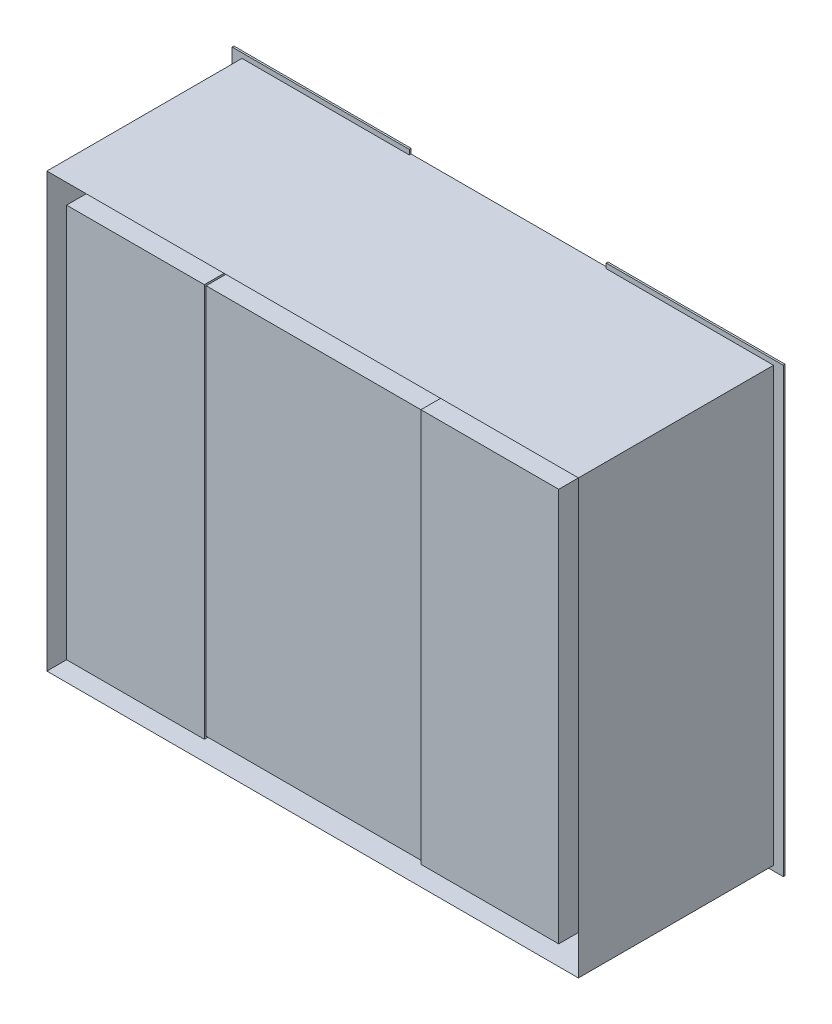
ISO-10303-21;
HEADER;
FILE_DESCRIPTION(('STEP AP214'),'2;1');
FILE_NAME('part.step','',(''),(''),'','','');
FILE_SCHEMA(('AUTOMOTIVE_DESIGN { 1 0 10303 214 1 1 1 1 }'));
ENDSEC;
DATA;
#1=APPLICATION_CONTEXT('core data for automotive mechanical design processes');
#2=APPLICATION_PROTOCOL_DEFINITION('international standard','automotive_design',2000,#1);
#3=PRODUCT_CONTEXT('',#1,'mechanical');
#4=PRODUCT('Part','Part','',(#3));
#5=PRODUCT_RELATED_PRODUCT_CATEGORY('part','',(#4));
#6=PRODUCT_DEFINITION_FORMATION('','',#4);
#7=PRODUCT_DEFINITION_CONTEXT('part definition',#1,'design');
#8=PRODUCT_DEFINITION('design','',#6,#7);
#9=PRODUCT_DEFINITION_SHAPE('','',#8);
#10=(LENGTH_UNIT() NAMED_UNIT(*) SI_UNIT(.MILLI.,.METRE.));
#11=(NAMED_UNIT(*) PLANE_ANGLE_UNIT() SI_UNIT($,.RADIAN.));
#12=(NAMED_UNIT(*) SI_UNIT($,.STERADIAN.) SOLID_ANGLE_UNIT());
#13=UNCERTAINTY_MEASURE_WITH_UNIT(LENGTH_MEASURE(1.E-05),#10,'distance_accuracy_value','');
#14=(GEOMETRIC_REPRESENTATION_CONTEXT(3) GLOBAL_UNCERTAINTY_ASSIGNED_CONTEXT((#13)) GLOBAL_UNIT_ASSIGNED_CONTEXT((#10,
#11,#12)) REPRESENTATION_CONTEXT('',''));
#15=CARTESIAN_POINT('',(0.,0.,0.));
#16=DIRECTION('',(0.,0.,1.));
#17=DIRECTION('',(1.,0.,0.));
#18=AXIS2_PLACEMENT_3D('',#15,#16,#17);
#19=CARTESIAN_POINT('',(-0.5,1.125,0.0762));
#20=DIRECTION('',(0.,1.,0.));
#21=DIRECTION('',(1.,0.,0.));
#22=AXIS2_PLACEMENT_3D('',#19,#20,#21);
#23=PLANE('',#22);
#24=DIRECTION('',(0.,0.,1.));
#25=VECTOR('',#24,1.);
#26=CARTESIAN_POINT('',(-1.4,1.125,0.0762));
#27=LINE('',#26,#25);
#28=CARTESIAN_POINT('',(-1.4,1.125,0.0762));
#29=VERTEX_POINT('',#28);
#30=CARTESIAN_POINT('',(-1.4,1.125,0.0852));
#31=VERTEX_POINT('',#30);
#32=EDGE_CURVE('P0_E11',#29,#31,#27,.T.);
#33=ORIENTED_EDGE('',*,*,#32,.T.);
#34=DIRECTION('',(-1.,0.,0.));
#35=VECTOR('',#34,1.);
#36=CARTESIAN_POINT('',(-0.5,1.125,0.0852));
#37=LINE('',#36,#35);
#38=CARTESIAN_POINT('',(-0.5,1.125,0.0852));
#39=VERTEX_POINT('',#38);
#40=EDGE_CURVE('P0_E263',#39,#31,#37,.T.);
#41=ORIENTED_EDGE('',*,*,#40,.F.);
#42=DIRECTION('',(0.,0.,1.));
#43=VECTOR('',#42,1.);
#44=CARTESIAN_POINT('',(-0.5,1.125,0.0762));
#45=LINE('',#44,#43);
#46=CARTESIAN_POINT('',(-0.5,1.125,0.0762));
#47=VERTEX_POINT('',#46);
#48=EDGE_CURVE('P0_E329',#47,#39,#45,.T.);
#49=ORIENTED_EDGE('',*,*,#48,.F.);
#50=DIRECTION('',(-1.,0.,0.));
#51=VECTOR('',#50,1.);
#52=CARTESIAN_POINT('',(-0.5,1.125,0.0762));
#53=LINE('',#52,#51);
#54=EDGE_CURVE('P0_E212',#47,#29,#53,.T.);
#55=ORIENTED_EDGE('',*,*,#54,.T.);
#56=EDGE_LOOP('',(#33,#41,#49,#55));
#57=FACE_BOUND('',#56,.T.);
#58=ADVANCED_FACE('P0_F17',(#57),#23,.T.);
#59=CARTESIAN_POINT('',(-1.4,1.125,0.0762));
#60=DIRECTION('',(-1.,0.,0.));
#61=DIRECTION('',(0.,0.,1.));
#62=AXIS2_PLACEMENT_3D('',#59,#60,#61);
#63=PLANE('',#62);
#64=DIRECTION('',(0.,0.,1.));
#65=VECTOR('',#64,1.);
#66=CARTESIAN_POINT('',(-1.4,-1.125,0.0762));
#67=LINE('',#66,#65);
#68=CARTESIAN_POINT('',(-1.4,-1.125,0.0762));
#69=VERTEX_POINT('',#68);
#70=CARTESIAN_POINT('',(-1.4,-1.125,0.0852));
#71=VERTEX_POINT('',#70);
#72=EDGE_CURVE('P0_E28',#69,#71,#67,.T.);
#73=ORIENTED_EDGE('',*,*,#72,.T.);
#74=DIRECTION('',(0.,-1.,0.));
#75=VECTOR('',#74,1.);
#76=CARTESIAN_POINT('',(-1.4,1.125,0.0852));
#77=LINE('',#76,#75);
#78=EDGE_CURVE('P0_E211',#31,#71,#77,.T.);
#79=ORIENTED_EDGE('',*,*,#78,.F.);
#80=ORIENTED_EDGE('',*,*,#32,.F.);
#81=DIRECTION('',(0.,-1.,0.));
#82=VECTOR('',#81,1.);
#83=CARTESIAN_POINT('',(-1.4,1.125,0.0762));
#84=LINE('',#83,#82);
#85=EDGE_CURVE('P0_E273',#29,#69,#84,.T.);
#86=ORIENTED_EDGE('',*,*,#85,.T.);
#87=EDGE_LOOP('',(#73,#79,#80,#86));
#88=FACE_BOUND('',#87,.T.);
#89=ADVANCED_FACE('P0_F541',(#88),#63,.T.);
#90=CARTESIAN_POINT('',(-1.4,-1.125,0.0762));
#91=DIRECTION('',(0.,-1.,0.));
#92=DIRECTION('',(0.,0.,-1.));
#93=AXIS2_PLACEMENT_3D('',#90,#91,#92);
#94=PLANE('',#93);
#95=DIRECTION('',(0.,0.,1.));
#96=VECTOR('',#95,1.);
#97=CARTESIAN_POINT('',(-0.5,-1.125,0.0762));
#98=LINE('',#97,#96);
#99=CARTESIAN_POINT('',(-0.5,-1.125,0.0762));
#100=VERTEX_POINT('',#99);
#101=CARTESIAN_POINT('',(-0.5,-1.125,0.0852));
#102=VERTEX_POINT('',#101);
#103=EDGE_CURVE('P0_E326',#100,#102,#98,.T.);
#104=ORIENTED_EDGE('',*,*,#103,.T.);
#105=DIRECTION('',(1.,0.,0.));
#106=VECTOR('',#105,1.);
#107=CARTESIAN_POINT('',(-1.4,-1.125,0.0852));
#108=LINE('',#107,#106);
#109=EDGE_CURVE('P0_E207',#71,#102,#108,.T.);
#110=ORIENTED_EDGE('',*,*,#109,.F.);
#111=ORIENTED_EDGE('',*,*,#72,.F.);
#112=DIRECTION('',(1.,0.,0.));
#113=VECTOR('',#112,1.);
#114=CARTESIAN_POINT('',(-1.4,-1.125,0.0762));
#115=LINE('',#114,#113);
#116=EDGE_CURVE('P0_E269',#69,#100,#115,.T.);
#117=ORIENTED_EDGE('',*,*,#116,.T.);
#118=EDGE_LOOP('',(#104,#110,#111,#117));
#119=FACE_BOUND('',#118,.T.);
#120=ADVANCED_FACE('P0_F549',(#119),#94,.T.);
#121=CARTESIAN_POINT('',(1.4,1.125,0.0762));
#122=DIRECTION('',(0.,1.,0.));
#123=DIRECTION('',(1.,0.,0.));
#124=AXIS2_PLACEMENT_3D('',#121,#122,#123);
#125=PLANE('',#124);
#126=DIRECTION('',(0.,0.,1.));
#127=VECTOR('',#126,1.);
#128=CARTESIAN_POINT('',(0.5,1.125,0.0762));
#129=LINE('',#128,#127);
#130=CARTESIAN_POINT('',(0.5,1.125,0.0762));
#131=VERTEX_POINT('',#130);
#132=CARTESIAN_POINT('',(0.5,1.125,0.0852));
#133=VERTEX_POINT('',#132);
#134=EDGE_CURVE('P0_E227',#131,#133,#129,.T.);
#135=ORIENTED_EDGE('',*,*,#134,.T.);
#136=DIRECTION('',(-1.,0.,0.));
#137=VECTOR('',#136,1.);
#138=CARTESIAN_POINT('',(1.4,1.125,0.0852));
#139=LINE('',#138,#137);
#140=CARTESIAN_POINT('',(1.4,1.125,0.0852));
#141=VERTEX_POINT('',#140);
#142=EDGE_CURVE('P0_E199',#141,#133,#139,.T.);
#143=ORIENTED_EDGE('',*,*,#142,.F.);
#144=DIRECTION('',(0.,0.,1.));
#145=VECTOR('',#144,1.);
#146=CARTESIAN_POINT('',(1.4,1.125,0.0762));
#147=LINE('',#146,#145);
#148=CARTESIAN_POINT('',(1.4,1.125,0.0762));
#149=VERTEX_POINT('',#148);
#150=EDGE_CURVE('P0_E284',#149,#141,#147,.T.);
#151=ORIENTED_EDGE('',*,*,#150,.F.);
#152=DIRECTION('',(-1.,0.,0.));
#153=VECTOR('',#152,1.);
#154=CARTESIAN_POINT('',(1.4,1.125,0.0762));
#155=LINE('',#154,#153);
#156=EDGE_CURVE('P0_E297',#149,#131,#155,.T.);
#157=ORIENTED_EDGE('',*,*,#156,.T.);
#158=EDGE_LOOP('',(#135,#143,#151,#157));
#159=FACE_BOUND('',#158,.T.);
#160=ADVANCED_FACE('P0_F554',(#159),#125,.T.);
#161=CARTESIAN_POINT('',(-0.55,1.,1.0672));
#162=DIRECTION('',(0.,0.,-1.));
#163=DIRECTION('',(0.,-1.,0.));
#164=AXIS2_PLACEMENT_3D('',#161,#162,#163);
#165=PLANE('',#164);
#166=DIRECTION('',(0.,-1.,0.));
#167=VECTOR('',#166,1.);
#168=CARTESIAN_POINT('',(-0.55,0.991,1.0672));
#169=LINE('',#168,#167);
#170=CARTESIAN_POINT('',(-0.55,0.991,1.0672));
#171=VERTEX_POINT('',#170);
#172=CARTESIAN_POINT('',(-0.55,-0.991,1.0672));
#173=VERTEX_POINT('',#172);
#174=EDGE_CURVE('P0_E283',#171,#173,#169,.T.);
#175=ORIENTED_EDGE('',*,*,#174,.T.);
#176=DIRECTION('',(1.,0.,0.));
#177=VECTOR('',#176,1.);
#178=CARTESIAN_POINT('',(-0.55,-0.991,1.0672));
#179=LINE('',#178,#177);
#180=CARTESIAN_POINT('',(0.55,-0.991,1.0672));
#181=VERTEX_POINT('',#180);
#182=EDGE_CURVE('P0_E42',#173,#181,#179,.T.);
#183=ORIENTED_EDGE('',*,*,#182,.T.);
#184=DIRECTION('',(0.,-1.,0.));
#185=VECTOR('',#184,1.);
#186=CARTESIAN_POINT('',(0.55,0.991,1.0672));
#187=LINE('',#186,#185);
#188=CARTESIAN_POINT('',(0.55,0.991,1.0672));
#189=VERTEX_POINT('',#188);
#190=EDGE_CURVE('P0_E378',#189,#181,#187,.T.);
#191=ORIENTED_EDGE('',*,*,#190,.F.);
#192=DIRECTION('',(1.,0.,0.));
#193=VECTOR('',#192,1.);
#194=CARTESIAN_POINT('',(-0.55,0.991,1.0672));
#195=LINE('',#194,#193);
#196=EDGE_CURVE('P0_E282',#171,#189,#195,.T.);
#197=ORIENTED_EDGE('',*,*,#196,.F.);
#198=EDGE_LOOP('',(#175,#183,#191,#197));
#199=FACE_BOUND('',#198,.T.);
#200=ADVANCED_FACE('P0_F498',(#199),#165,.F.);
#201=CARTESIAN_POINT('',(-0.55,-0.991,1.0762));
#202=DIRECTION('',(0.,1.,0.));
#203=DIRECTION('',(1.,0.,0.));
#204=AXIS2_PLACEMENT_3D('',#201,#202,#203);
#205=PLANE('',#204);
#206=DIRECTION('',(1.,0.,0.));
#207=VECTOR('',#206,1.);
#208=CARTESIAN_POINT('',(-0.5,-0.991,0.0852));
#209=LINE('',#208,#207);
#210=CARTESIAN_POINT('',(-0.5,-0.991,0.0852));
#211=VERTEX_POINT('',#210);
#212=CARTESIAN_POINT('',(0.5,-0.991,0.0852));
#213=VERTEX_POINT('',#212);
#214=EDGE_CURVE('P0_E234',#211,#213,#209,.T.);
#215=ORIENTED_EDGE('',*,*,#214,.T.);
#216=DIRECTION('',(1.,0.,0.));
#217=VECTOR('',#216,1.);
#218=CARTESIAN_POINT('',(0.5,-0.991,0.0852));
#219=LINE('',#218,#217);
#220=CARTESIAN_POINT('',(0.55,-0.991,0.0852));
#221=VERTEX_POINT('',#220);
#222=EDGE_CURVE('P0_E242',#213,#221,#219,.T.);
#223=ORIENTED_EDGE('',*,*,#222,.T.);
#224=DIRECTION('',(0.,0.,-1.));
#225=VECTOR('',#224,1.);
#226=CARTESIAN_POINT('',(0.55,-0.991,1.0672));
#227=LINE('',#226,#225);
#228=EDGE_CURVE('P0_E206',#181,#221,#227,.T.);
#229=ORIENTED_EDGE('',*,*,#228,.F.);
#230=ORIENTED_EDGE('',*,*,#182,.F.);
#231=DIRECTION('',(0.,0.,-1.));
#232=VECTOR('',#231,1.);
#233=CARTESIAN_POINT('',(-0.55,-0.991,1.0672));
#234=LINE('',#233,#232);
#235=CARTESIAN_POINT('',(-0.55,-0.991,0.0852));
#236=VERTEX_POINT('',#235);
#237=EDGE_CURVE('P0_E374',#173,#236,#234,.T.);
#238=ORIENTED_EDGE('',*,*,#237,.T.);
#239=DIRECTION('',(1.,0.,0.));
#240=VECTOR('',#239,1.);
#241=CARTESIAN_POINT('',(-0.55,-0.991,0.0852));
#242=LINE('',#241,#240);
#243=EDGE_CURVE('P0_E210',#236,#211,#242,.T.);
#244=ORIENTED_EDGE('',*,*,#243,.T.);
#245=EDGE_LOOP('',(#215,#223,#229,#230,#238,#244));
#246=FACE_BOUND('',#245,.T.);
#247=ADVANCED_FACE('P0_F497',(#246),#205,.F.);
#248=CARTESIAN_POINT('',(0.55,-1.,0.0852));
#249=DIRECTION('',(1.,0.,0.));
#250=DIRECTION('',(0.,1.,0.));
#251=AXIS2_PLACEMENT_3D('',#248,#249,#250);
#252=PLANE('',#251);
#253=DIRECTION('',(0.,0.,1.));
#254=VECTOR('',#253,1.);
#255=CARTESIAN_POINT('',(0.55,-1.,0.0852));
#256=LINE('',#255,#254);
#257=CARTESIAN_POINT('',(0.55,-1.,0.0852));
#258=VERTEX_POINT('',#257);
#259=CARTESIAN_POINT('',(0.55,-1.,1.0762));
#260=VERTEX_POINT('',#259);
#261=EDGE_CURVE('P0_E251',#258,#260,#256,.T.);
#262=ORIENTED_EDGE('',*,*,#261,.T.);
#263=DIRECTION('',(0.,1.,0.));
#264=VECTOR('',#263,1.);
#265=CARTESIAN_POINT('',(0.55,-1.,1.0762));
#266=LINE('',#265,#264);
#267=CARTESIAN_POINT('',(0.55,1.,1.0762));
#268=VERTEX_POINT('',#267);
#269=EDGE_CURVE('P0_E169',#260,#268,#266,.T.);
#270=ORIENTED_EDGE('',*,*,#269,.T.);
#271=DIRECTION('',(0.,0.,1.));
#272=VECTOR('',#271,1.);
#273=CARTESIAN_POINT('',(0.55,1.,0.0852));
#274=LINE('',#273,#272);
#275=CARTESIAN_POINT('',(0.55,1.,0.0852));
#276=VERTEX_POINT('',#275);
#277=EDGE_CURVE('P0_E160',#276,#268,#274,.T.);
#278=ORIENTED_EDGE('',*,*,#277,.F.);
#279=DIRECTION('',(0.,1.,0.));
#280=VECTOR('',#279,1.);
#281=CARTESIAN_POINT('',(0.55,0.991,0.0852));
#282=LINE('',#281,#280);
#283=CARTESIAN_POINT('',(0.55,0.991,0.0852));
#284=VERTEX_POINT('',#283);
#285=EDGE_CURVE('P0_E166',#284,#276,#282,.T.);
#286=ORIENTED_EDGE('',*,*,#285,.F.);
#287=DIRECTION('',(0.,0.,1.));
#288=VECTOR('',#287,1.);
#289=CARTESIAN_POINT('',(0.55,0.991,0.0852));
#290=LINE('',#289,#288);
#291=EDGE_CURVE('P0_E21',#284,#189,#290,.T.);
#292=ORIENTED_EDGE('',*,*,#291,.T.);
#293=ORIENTED_EDGE('',*,*,#190,.T.);
#294=ORIENTED_EDGE('',*,*,#228,.T.);
#295=DIRECTION('',(0.,1.,0.));
#296=VECTOR('',#295,1.);
#297=CARTESIAN_POINT('',(0.55,-1.,0.0852));
#298=LINE('',#297,#296);
#299=EDGE_CURVE('P0_E332',#258,#221,#298,.T.);
#300=ORIENTED_EDGE('',*,*,#299,.F.);
#301=EDGE_LOOP('',(#262,#270,#278,#286,#292,#293,#294,#300));
#302=FACE_BOUND('',#301,.T.);
#303=ADVANCED_FACE('P0_F163',(#302),#252,.F.);
#304=CARTESIAN_POINT('',(-0.55,0.991,0.0762));
#305=DIRECTION('',(0.,-1.,0.));
#306=DIRECTION('',(0.,0.,-1.));
#307=AXIS2_PLACEMENT_3D('',#304,#305,#306);
#308=PLANE('',#307);
#309=DIRECTION('',(0.,0.,1.));
#310=VECTOR('',#309,1.);
#311=CARTESIAN_POINT('',(-0.55,0.991,0.0852));
#312=LINE('',#311,#310);
#313=CARTESIAN_POINT('',(-0.55,0.991,0.0852));
#314=VERTEX_POINT('',#313);
#315=EDGE_CURVE('P0_E152',#314,#171,#312,.T.);
#316=ORIENTED_EDGE('',*,*,#315,.T.);
#317=ORIENTED_EDGE('',*,*,#196,.T.);
#318=ORIENTED_EDGE('',*,*,#291,.F.);
#319=DIRECTION('',(1.,0.,0.));
#320=VECTOR('',#319,1.);
#321=CARTESIAN_POINT('',(0.5,0.991,0.0852));
#322=LINE('',#321,#320);
#323=CARTESIAN_POINT('',(0.5,0.991,0.0852));
#324=VERTEX_POINT('',#323);
#325=EDGE_CURVE('P0_E190',#324,#284,#322,.T.);
#326=ORIENTED_EDGE('',*,*,#325,.F.);
#327=DIRECTION('',(1.,0.,0.));
#328=VECTOR('',#327,1.);
#329=CARTESIAN_POINT('',(-0.5,0.991,0.0852));
#330=LINE('',#329,#328);
#331=CARTESIAN_POINT('',(-0.5,0.991,0.0852));
#332=VERTEX_POINT('',#331);
#333=EDGE_CURVE('P0_E239',#332,#324,#330,.T.);
#334=ORIENTED_EDGE('',*,*,#333,.F.);
#335=DIRECTION('',(1.,0.,0.));
#336=VECTOR('',#335,1.);
#337=CARTESIAN_POINT('',(-0.55,0.991,0.0852));
#338=LINE('',#337,#336);
#339=EDGE_CURVE('P0_E250',#314,#332,#338,.T.);
#340=ORIENTED_EDGE('',*,*,#339,.F.);
#341=EDGE_LOOP('',(#316,#317,#318,#326,#334,#340));
#342=FACE_BOUND('',#341,.T.);
#343=ADVANCED_FACE('P0_F503',(#342),#308,.F.);
#344=CARTESIAN_POINT('',(-0.55,-1.,0.0762));
#345=DIRECTION('',(-1.,0.,0.));
#346=DIRECTION('',(0.,0.,1.));
#347=AXIS2_PLACEMENT_3D('',#344,#345,#346);
#348=PLANE('',#347);
#349=ORIENTED_EDGE('',*,*,#237,.F.);
#350=ORIENTED_EDGE('',*,*,#174,.F.);
#351=ORIENTED_EDGE('',*,*,#315,.F.);
#352=DIRECTION('',(0.,1.,0.));
#353=VECTOR('',#352,1.);
#354=CARTESIAN_POINT('',(-0.55,0.991,0.0852));
#355=LINE('',#354,#353);
#356=CARTESIAN_POINT('',(-0.55,1.,0.0852));
#357=VERTEX_POINT('',#356);
#358=EDGE_CURVE('P0_E186',#314,#357,#355,.T.);
#359=ORIENTED_EDGE('',*,*,#358,.T.);
#360=DIRECTION('',(0.,0.,1.));
#361=VECTOR('',#360,1.);
#362=CARTESIAN_POINT('',(-0.55,1.,0.0852));
#363=LINE('',#362,#361);
#364=CARTESIAN_POINT('',(-0.55,1.,1.0762));
#365=VERTEX_POINT('',#364);
#366=EDGE_CURVE('P0_E278',#357,#365,#363,.T.);
#367=ORIENTED_EDGE('',*,*,#366,.T.);
#368=DIRECTION('',(0.,1.,0.));
#369=VECTOR('',#368,1.);
#370=CARTESIAN_POINT('',(-0.55,-1.,1.0762));
#371=LINE('',#370,#369);
#372=CARTESIAN_POINT('',(-0.55,-1.,1.0762));
#373=VERTEX_POINT('',#372);
#374=EDGE_CURVE('P0_E371',#373,#365,#371,.T.);
#375=ORIENTED_EDGE('',*,*,#374,.F.);
#376=DIRECTION('',(0.,0.,1.));
#377=VECTOR('',#376,1.);
#378=CARTESIAN_POINT('',(-0.55,-1.,0.0852));
#379=LINE('',#378,#377);
#380=CARTESIAN_POINT('',(-0.55,-1.,0.0852));
#381=VERTEX_POINT('',#380);
#382=EDGE_CURVE('P0_E222',#381,#373,#379,.T.);
#383=ORIENTED_EDGE('',*,*,#382,.F.);
#384=DIRECTION('',(0.,1.,0.));
#385=VECTOR('',#384,1.);
#386=CARTESIAN_POINT('',(-0.55,-1.,0.0852));
#387=LINE('',#386,#385);
#388=EDGE_CURVE('P0_E293',#381,#236,#387,.T.);
#389=ORIENTED_EDGE('',*,*,#388,.T.);
#390=EDGE_LOOP('',(#349,#350,#351,#359,#367,#375,#383,#389));
#391=FACE_BOUND('',#390,.T.);
#392=ADVANCED_FACE('P0_F481',(#391),#348,.F.);
#393=CARTESIAN_POINT('',(0.,0.,1.0762));
#394=DIRECTION('',(0.,0.,1.));
#395=DIRECTION('',(1.,0.,0.));
#396=AXIS2_PLACEMENT_3D('',#393,#394,#395);
#397=PLANE('',#396);
#398=DIRECTION('',(1.,0.,0.));
#399=VECTOR('',#398,1.);
#400=CARTESIAN_POINT('',(0.55,-1.,1.0762));
#401=LINE('',#400,#399);
#402=CARTESIAN_POINT('',(1.25,-1.,1.0762));
#403=VERTEX_POINT('',#402);
#404=EDGE_CURVE('P0_E255',#260,#403,#401,.T.);
#405=ORIENTED_EDGE('',*,*,#404,.T.);
#406=DIRECTION('',(0.,1.,0.));
#407=VECTOR('',#406,1.);
#408=CARTESIAN_POINT('',(1.25,-1.,1.0762));
#409=LINE('',#408,#407);
#410=CARTESIAN_POINT('',(1.25,1.,1.0762));
#411=VERTEX_POINT('',#410);
#412=EDGE_CURVE('P0_E223',#403,#411,#409,.T.);
#413=ORIENTED_EDGE('',*,*,#412,.T.);
#414=DIRECTION('',(-1.,0.,0.));
#415=VECTOR('',#414,1.);
#416=CARTESIAN_POINT('',(1.25,1.,1.0762));
#417=LINE('',#416,#415);
#418=EDGE_CURVE('P0_E174',#411,#268,#417,.T.);
#419=ORIENTED_EDGE('',*,*,#418,.T.);
#420=ORIENTED_EDGE('',*,*,#269,.F.);
#421=EDGE_LOOP('',(#405,#413,#419,#420));
#422=FACE_BOUND('',#421,.T.);
#423=ADVANCED_FACE('P0_F417',(#422),#397,.T.);
#424=CARTESIAN_POINT('',(0.,0.,1.0762));
#425=DIRECTION('',(0.,0.,1.));
#426=DIRECTION('',(1.,0.,0.));
#427=AXIS2_PLACEMENT_3D('',#424,#425,#426);
#428=PLANE('',#427);
#429=DIRECTION('',(-1.,0.,0.));
#430=VECTOR('',#429,1.);
#431=CARTESIAN_POINT('',(-0.55,1.,1.0762));
#432=LINE('',#431,#430);
#433=CARTESIAN_POINT('',(-1.25,1.,1.0762));
#434=VERTEX_POINT('',#433);
#435=EDGE_CURVE('P0_E274',#365,#434,#432,.T.);
#436=ORIENTED_EDGE('',*,*,#435,.T.);
#437=DIRECTION('',(0.,-1.,0.));
#438=VECTOR('',#437,1.);
#439=CARTESIAN_POINT('',(-1.25,1.,1.0762));
#440=LINE('',#439,#438);
#441=CARTESIAN_POINT('',(-1.25,-1.,1.0762));
#442=VERTEX_POINT('',#441);
#443=EDGE_CURVE('P0_E254',#434,#442,#440,.T.);
#444=ORIENTED_EDGE('',*,*,#443,.T.);
#445=DIRECTION('',(1.,0.,0.));
#446=VECTOR('',#445,1.);
#447=CARTESIAN_POINT('',(-1.25,-1.,1.0762));
#448=LINE('',#447,#446);
#449=EDGE_CURVE('P0_E268',#442,#373,#448,.T.);
#450=ORIENTED_EDGE('',*,*,#449,.T.);
#451=ORIENTED_EDGE('',*,*,#374,.T.);
#452=EDGE_LOOP('',(#436,#444,#450,#451));
#453=FACE_BOUND('',#452,.T.);
#454=ADVANCED_FACE('P0_F486',(#453),#428,.T.);
#455=CARTESIAN_POINT('',(-1.25,1.,0.0762));
#456=DIRECTION('',(-1.,0.,0.));
#457=DIRECTION('',(0.,0.,1.));
#458=AXIS2_PLACEMENT_3D('',#455,#456,#457);
#459=PLANE('',#458);
#460=DIRECTION('',(0.,0.,1.));
#461=VECTOR('',#460,1.);
#462=CARTESIAN_POINT('',(-1.25,-1.,0.0852));
#463=LINE('',#462,#461);
#464=CARTESIAN_POINT('',(-1.25,-1.,0.0852));
#465=VERTEX_POINT('',#464);
#466=EDGE_CURVE('P0_E346',#465,#442,#463,.T.);
#467=ORIENTED_EDGE('',*,*,#466,.T.);
#468=ORIENTED_EDGE('',*,*,#443,.F.);
#469=DIRECTION('',(0.,0.,1.));
#470=VECTOR('',#469,1.);
#471=CARTESIAN_POINT('',(-1.25,1.,0.0852));
#472=LINE('',#471,#470);
#473=CARTESIAN_POINT('',(-1.25,1.,0.0852));
#474=VERTEX_POINT('',#473);
#475=EDGE_CURVE('P0_E279',#474,#434,#472,.T.);
#476=ORIENTED_EDGE('',*,*,#475,.F.);
#477=DIRECTION('',(0.,-1.,0.));
#478=VECTOR('',#477,1.);
#479=CARTESIAN_POINT('',(-1.25,1.,0.0852));
#480=LINE('',#479,#478);
#481=EDGE_CURVE('P0_E361',#474,#465,#480,.T.);
#482=ORIENTED_EDGE('',*,*,#481,.T.);
#483=EDGE_LOOP('',(#467,#468,#476,#482));
#484=FACE_BOUND('',#483,.T.);
#485=ADVANCED_FACE('P0_F575',(#484),#459,.T.);
#486=CARTESIAN_POINT('',(-1.25,-1.,0.0762));
#487=DIRECTION('',(0.,-1.,0.));
#488=DIRECTION('',(0.,0.,-1.));
#489=AXIS2_PLACEMENT_3D('',#486,#487,#488);
#490=PLANE('',#489);
#491=DIRECTION('',(0.,0.,1.));
#492=VECTOR('',#491,1.);
#493=CARTESIAN_POINT('',(1.25,-1.,0.0852));
#494=LINE('',#493,#492);
#495=CARTESIAN_POINT('',(1.25,-1.,0.0852));
#496=VERTEX_POINT('',#495);
#497=EDGE_CURVE('P0_E218',#496,#403,#494,.T.);
#498=ORIENTED_EDGE('',*,*,#497,.T.);
#499=ORIENTED_EDGE('',*,*,#404,.F.);
#500=ORIENTED_EDGE('',*,*,#261,.F.);
#501=DIRECTION('',(1.,0.,0.));
#502=VECTOR('',#501,1.);
#503=CARTESIAN_POINT('',(0.55,-1.,0.0852));
#504=LINE('',#503,#502);
#505=EDGE_CURVE('P0_E232',#258,#496,#504,.T.);
#506=ORIENTED_EDGE('',*,*,#505,.T.);
#507=EDGE_LOOP('',(#498,#499,#500,#506));
#508=FACE_BOUND('',#507,.T.);
#509=ADVANCED_FACE('P0_F524',(#508),#490,.T.);
#510=CARTESIAN_POINT('',(-1.25,-1.,0.0762));
#511=DIRECTION('',(0.,-1.,0.));
#512=DIRECTION('',(0.,0.,-1.));
#513=AXIS2_PLACEMENT_3D('',#510,#511,#512);
#514=PLANE('',#513);
#515=ORIENTED_EDGE('',*,*,#382,.T.);
#516=ORIENTED_EDGE('',*,*,#449,.F.);
#517=ORIENTED_EDGE('',*,*,#466,.F.);
#518=DIRECTION('',(1.,0.,0.));
#519=VECTOR('',#518,1.);
#520=CARTESIAN_POINT('',(-1.25,-1.,0.0852));
#521=LINE('',#520,#519);
#522=EDGE_CURVE('P0_E203',#465,#381,#521,.T.);
#523=ORIENTED_EDGE('',*,*,#522,.T.);
#524=EDGE_LOOP('',(#515,#516,#517,#523));
#525=FACE_BOUND('',#524,.T.);
#526=ADVANCED_FACE('P0_F488',(#525),#514,.T.);
#527=CARTESIAN_POINT('',(1.25,-1.,0.0762));
#528=DIRECTION('',(1.,0.,0.));
#529=DIRECTION('',(0.,1.,0.));
#530=AXIS2_PLACEMENT_3D('',#527,#528,#529);
#531=PLANE('',#530);
#532=DIRECTION('',(0.,0.,1.));
#533=VECTOR('',#532,1.);
#534=CARTESIAN_POINT('',(1.25,1.,0.0852));
#535=LINE('',#534,#533);
#536=CARTESIAN_POINT('',(1.25,1.,0.0852));
#537=VERTEX_POINT('',#536);
#538=EDGE_CURVE('P0_E181',#537,#411,#535,.T.);
#539=ORIENTED_EDGE('',*,*,#538,.T.);
#540=ORIENTED_EDGE('',*,*,#412,.F.);
#541=ORIENTED_EDGE('',*,*,#497,.F.);
#542=DIRECTION('',(0.,1.,0.));
#543=VECTOR('',#542,1.);
#544=CARTESIAN_POINT('',(1.25,-1.,0.0852));
#545=LINE('',#544,#543);
#546=EDGE_CURVE('P0_E229',#496,#537,#545,.T.);
#547=ORIENTED_EDGE('',*,*,#546,.T.);
#548=EDGE_LOOP('',(#539,#540,#541,#547));
#549=FACE_BOUND('',#548,.T.);
#550=ADVANCED_FACE('P0_F528',(#549),#531,.T.);
#551=CARTESIAN_POINT('',(1.25,1.,0.0762));
#552=DIRECTION('',(0.,1.,0.));
#553=DIRECTION('',(1.,0.,0.));
#554=AXIS2_PLACEMENT_3D('',#551,#552,#553);
#555=PLANE('',#554);
#556=ORIENTED_EDGE('',*,*,#475,.T.);
#557=ORIENTED_EDGE('',*,*,#435,.F.);
#558=ORIENTED_EDGE('',*,*,#366,.F.);
#559=DIRECTION('',(-1.,0.,0.));
#560=VECTOR('',#559,1.);
#561=CARTESIAN_POINT('',(-0.55,1.,0.0852));
#562=LINE('',#561,#560);
#563=EDGE_CURVE('P0_E175',#357,#474,#562,.T.);
#564=ORIENTED_EDGE('',*,*,#563,.T.);
#565=EDGE_LOOP('',(#556,#557,#558,#564));
#566=FACE_BOUND('',#565,.T.);
#567=ADVANCED_FACE('P0_F509',(#566),#555,.T.);
#568=CARTESIAN_POINT('',(1.25,1.,0.0762));
#569=DIRECTION('',(0.,1.,0.));
#570=DIRECTION('',(1.,0.,0.));
#571=AXIS2_PLACEMENT_3D('',#568,#569,#570);
#572=PLANE('',#571);
#573=ORIENTED_EDGE('',*,*,#277,.T.);
#574=ORIENTED_EDGE('',*,*,#418,.F.);
#575=ORIENTED_EDGE('',*,*,#538,.F.);
#576=DIRECTION('',(-1.,0.,0.));
#577=VECTOR('',#576,1.);
#578=CARTESIAN_POINT('',(1.25,1.,0.0852));
#579=LINE('',#578,#577);
#580=EDGE_CURVE('P0_E178',#537,#276,#579,.T.);
#581=ORIENTED_EDGE('',*,*,#580,.T.);
#582=EDGE_LOOP('',(#573,#574,#575,#581));
#583=FACE_BOUND('',#582,.T.);
#584=ADVANCED_FACE('P0_F179',(#583),#572,.T.);
#585=CARTESIAN_POINT('',(0.,0.,0.0852));
#586=DIRECTION('',(0.,0.,1.));
#587=DIRECTION('',(1.,0.,0.));
#588=AXIS2_PLACEMENT_3D('',#585,#586,#587);
#589=PLANE('',#588);
#590=ORIENTED_EDGE('',*,*,#358,.F.);
#591=ORIENTED_EDGE('',*,*,#339,.T.);
#592=DIRECTION('',(0.,1.,0.));
#593=VECTOR('',#592,1.);
#594=CARTESIAN_POINT('',(-0.5,0.991,0.0852));
#595=LINE('',#594,#593);
#596=EDGE_CURVE('P0_E233',#332,#39,#595,.T.);
#597=ORIENTED_EDGE('',*,*,#596,.T.);
#598=ORIENTED_EDGE('',*,*,#40,.T.);
#599=ORIENTED_EDGE('',*,*,#78,.T.);
#600=ORIENTED_EDGE('',*,*,#109,.T.);
#601=DIRECTION('',(0.,1.,0.));
#602=VECTOR('',#601,1.);
#603=CARTESIAN_POINT('',(-0.5,-1.125,0.0852));
#604=LINE('',#603,#602);
#605=EDGE_CURVE('P0_E330',#102,#211,#604,.T.);
#606=ORIENTED_EDGE('',*,*,#605,.T.);
#607=ORIENTED_EDGE('',*,*,#243,.F.);
#608=ORIENTED_EDGE('',*,*,#388,.F.);
#609=ORIENTED_EDGE('',*,*,#522,.F.);
#610=ORIENTED_EDGE('',*,*,#481,.F.);
#611=ORIENTED_EDGE('',*,*,#563,.F.);
#612=EDGE_LOOP('',(#590,#591,#597,#598,#599,#600,#606,#607,#608,#609,#610,#611));
#613=FACE_BOUND('',#612,.T.);
#614=ADVANCED_FACE('P0_F495',(#613),#589,.T.);
#615=CARTESIAN_POINT('',(0.,0.,0.0852));
#616=DIRECTION('',(0.,0.,1.));
#617=DIRECTION('',(1.,0.,0.));
#618=AXIS2_PLACEMENT_3D('',#615,#616,#617);
#619=PLANE('',#618);
#620=ORIENTED_EDGE('',*,*,#546,.F.);
#621=ORIENTED_EDGE('',*,*,#505,.F.);
#622=ORIENTED_EDGE('',*,*,#299,.T.);
#623=ORIENTED_EDGE('',*,*,#222,.F.);
#624=DIRECTION('',(0.,-1.,0.));
#625=VECTOR('',#624,1.);
#626=CARTESIAN_POINT('',(0.5,-0.991,0.0852));
#627=LINE('',#626,#625);
#628=CARTESIAN_POINT('',(0.5,-1.125,0.0852));
#629=VERTEX_POINT('',#628);
#630=EDGE_CURVE('P0_E260',#213,#629,#627,.T.);
#631=ORIENTED_EDGE('',*,*,#630,.T.);
#632=DIRECTION('',(1.,0.,0.));
#633=VECTOR('',#632,1.);
#634=CARTESIAN_POINT('',(0.5,-1.125,0.0852));
#635=LINE('',#634,#633);
#636=CARTESIAN_POINT('',(1.4,-1.125,0.0852));
#637=VERTEX_POINT('',#636);
#638=EDGE_CURVE('P0_E292',#629,#637,#635,.T.);
#639=ORIENTED_EDGE('',*,*,#638,.T.);
#640=DIRECTION('',(0.,1.,0.));
#641=VECTOR('',#640,1.);
#642=CARTESIAN_POINT('',(1.4,-1.125,0.0852));
#643=LINE('',#642,#641);
#644=EDGE_CURVE('P0_E288',#637,#141,#643,.T.);
#645=ORIENTED_EDGE('',*,*,#644,.T.);
#646=ORIENTED_EDGE('',*,*,#142,.T.);
#647=DIRECTION('',(0.,-1.,0.));
#648=VECTOR('',#647,1.);
#649=CARTESIAN_POINT('',(0.5,1.125,0.0852));
#650=LINE('',#649,#648);
#651=EDGE_CURVE('P0_E224',#133,#324,#650,.T.);
#652=ORIENTED_EDGE('',*,*,#651,.T.);
#653=ORIENTED_EDGE('',*,*,#325,.T.);
#654=ORIENTED_EDGE('',*,*,#285,.T.);
#655=ORIENTED_EDGE('',*,*,#580,.F.);
#656=EDGE_LOOP('',(#620,#621,#622,#623,#631,#639,#645,#646,#652,#653,#654,#655));
#657=FACE_BOUND('',#656,.T.);
#658=ADVANCED_FACE('P0_F188',(#657),#619,.T.);
#659=CARTESIAN_POINT('',(-0.5,-1.125,0.0762));
#660=DIRECTION('',(1.,0.,0.));
#661=DIRECTION('',(0.,1.,0.));
#662=AXIS2_PLACEMENT_3D('',#659,#660,#661);
#663=PLANE('',#662);
#664=ORIENTED_EDGE('',*,*,#605,.F.);
#665=ORIENTED_EDGE('',*,*,#103,.F.);
#666=DIRECTION('',(0.,1.,0.));
#667=VECTOR('',#666,1.);
#668=CARTESIAN_POINT('',(-0.5,-1.125,0.0762));
#669=LINE('',#668,#667);
#670=EDGE_CURVE('P0_E216',#100,#47,#669,.T.);
#671=ORIENTED_EDGE('',*,*,#670,.T.);
#672=ORIENTED_EDGE('',*,*,#48,.T.);
#673=ORIENTED_EDGE('',*,*,#596,.F.);
#674=DIRECTION('',(0.,1.,0.));
#675=VECTOR('',#674,1.);
#676=CARTESIAN_POINT('',(-0.5,-0.991,0.0852));
#677=LINE('',#676,#675);
#678=EDGE_CURVE('P0_E238',#211,#332,#677,.T.);
#679=ORIENTED_EDGE('',*,*,#678,.F.);
#680=EDGE_LOOP('',(#664,#665,#671,#672,#673,#679));
#681=FACE_BOUND('',#680,.T.);
#682=ADVANCED_FACE('P0_F582',(#681),#663,.T.);
#683=CARTESIAN_POINT('',(-0.55,-1.,0.0852));
#684=DIRECTION('',(0.,0.,1.));
#685=DIRECTION('',(1.,0.,0.));
#686=AXIS2_PLACEMENT_3D('',#683,#684,#685);
#687=PLANE('',#686);
#688=ORIENTED_EDGE('',*,*,#333,.T.);
#689=DIRECTION('',(0.,1.,0.));
#690=VECTOR('',#689,1.);
#691=CARTESIAN_POINT('',(0.5,-0.991,0.0852));
#692=LINE('',#691,#690);
#693=EDGE_CURVE('P0_E256',#213,#324,#692,.T.);
#694=ORIENTED_EDGE('',*,*,#693,.F.);
#695=ORIENTED_EDGE('',*,*,#214,.F.);
#696=ORIENTED_EDGE('',*,*,#678,.T.);
#697=EDGE_LOOP('',(#688,#694,#695,#696));
#698=FACE_BOUND('',#697,.T.);
#699=ADVANCED_FACE('P0_F567',(#698),#687,.F.);
#700=CARTESIAN_POINT('',(0.5,1.125,0.0762));
#701=DIRECTION('',(-1.,0.,0.));
#702=DIRECTION('',(0.,0.,1.));
#703=AXIS2_PLACEMENT_3D('',#700,#701,#702);
#704=PLANE('',#703);
#705=ORIENTED_EDGE('',*,*,#651,.F.);
#706=ORIENTED_EDGE('',*,*,#134,.F.);
#707=DIRECTION('',(0.,-1.,0.));
#708=VECTOR('',#707,1.);
#709=CARTESIAN_POINT('',(0.5,1.125,0.0762));
#710=LINE('',#709,#708);
#711=CARTESIAN_POINT('',(0.5,-1.125,0.0762));
#712=VERTEX_POINT('',#711);
#713=EDGE_CURVE('P0_E247',#131,#712,#710,.T.);
#714=ORIENTED_EDGE('',*,*,#713,.T.);
#715=DIRECTION('',(0.,0.,1.));
#716=VECTOR('',#715,1.);
#717=CARTESIAN_POINT('',(0.5,-1.125,0.0762));
#718=LINE('',#717,#716);
#719=EDGE_CURVE('P0_E228',#712,#629,#718,.T.);
#720=ORIENTED_EDGE('',*,*,#719,.T.);
#721=ORIENTED_EDGE('',*,*,#630,.F.);
#722=ORIENTED_EDGE('',*,*,#693,.T.);
#723=EDGE_LOOP('',(#705,#706,#714,#720,#721,#722));
#724=FACE_BOUND('',#723,.T.);
#725=ADVANCED_FACE('P0_F563',(#724),#704,.T.);
#726=CARTESIAN_POINT('',(0.5,-1.125,0.0762));
#727=DIRECTION('',(0.,-1.,0.));
#728=DIRECTION('',(0.,0.,-1.));
#729=AXIS2_PLACEMENT_3D('',#726,#727,#728);
#730=PLANE('',#729);
#731=DIRECTION('',(0.,0.,1.));
#732=VECTOR('',#731,1.);
#733=CARTESIAN_POINT('',(1.4,-1.125,0.0762));
#734=LINE('',#733,#732);
#735=CARTESIAN_POINT('',(1.4,-1.125,0.0762));
#736=VERTEX_POINT('',#735);
#737=EDGE_CURVE('P0_E339',#736,#637,#734,.T.);
#738=ORIENTED_EDGE('',*,*,#737,.T.);
#739=ORIENTED_EDGE('',*,*,#638,.F.);
#740=ORIENTED_EDGE('',*,*,#719,.F.);
#741=DIRECTION('',(1.,0.,0.));
#742=VECTOR('',#741,1.);
#743=CARTESIAN_POINT('',(0.5,-1.125,0.0762));
#744=LINE('',#743,#742);
#745=EDGE_CURVE('P0_E243',#712,#736,#744,.T.);
#746=ORIENTED_EDGE('',*,*,#745,.T.);
#747=EDGE_LOOP('',(#738,#739,#740,#746));
#748=FACE_BOUND('',#747,.T.);
#749=ADVANCED_FACE('P0_F560',(#748),#730,.T.);
#750=CARTESIAN_POINT('',(1.4,-1.125,0.0762));
#751=DIRECTION('',(1.,0.,0.));
#752=DIRECTION('',(0.,1.,0.));
#753=AXIS2_PLACEMENT_3D('',#750,#751,#752);
#754=PLANE('',#753);
#755=ORIENTED_EDGE('',*,*,#150,.T.);
#756=ORIENTED_EDGE('',*,*,#644,.F.);
#757=ORIENTED_EDGE('',*,*,#737,.F.);
#758=DIRECTION('',(0.,1.,0.));
#759=VECTOR('',#758,1.);
#760=CARTESIAN_POINT('',(1.4,-1.125,0.0762));
#761=LINE('',#760,#759);
#762=EDGE_CURVE('P0_E217',#736,#149,#761,.T.);
#763=ORIENTED_EDGE('',*,*,#762,.T.);
#764=EDGE_LOOP('',(#755,#756,#757,#763));
#765=FACE_BOUND('',#764,.T.);
#766=ADVANCED_FACE('P0_F562',(#765),#754,.T.);
#767=CARTESIAN_POINT('',(0.,0.,0.0762));
#768=DIRECTION('',(0.,0.,1.));
#769=DIRECTION('',(1.,0.,0.));
#770=AXIS2_PLACEMENT_3D('',#767,#768,#769);
#771=PLANE('',#770);
#772=ORIENTED_EDGE('',*,*,#54,.F.);
#773=ORIENTED_EDGE('',*,*,#670,.F.);
#774=ORIENTED_EDGE('',*,*,#116,.F.);
#775=ORIENTED_EDGE('',*,*,#85,.F.);
#776=EDGE_LOOP('',(#772,#773,#774,#775));
#777=FACE_BOUND('',#776,.T.);
#778=ADVANCED_FACE('P0_F569',(#777),#771,.F.);
#779=CARTESIAN_POINT('',(0.,0.,0.0762));
#780=DIRECTION('',(0.,0.,1.));
#781=DIRECTION('',(1.,0.,0.));
#782=AXIS2_PLACEMENT_3D('',#779,#780,#781);
#783=PLANE('',#782);
#784=ORIENTED_EDGE('',*,*,#745,.F.);
#785=ORIENTED_EDGE('',*,*,#713,.F.);
#786=ORIENTED_EDGE('',*,*,#156,.F.);
#787=ORIENTED_EDGE('',*,*,#762,.F.);
#788=EDGE_LOOP('',(#784,#785,#786,#787));
#789=FACE_BOUND('',#788,.T.);
#790=ADVANCED_FACE('P0_F19',(#789),#783,.F.);
#791=CLOSED_SHELL('',(#58,#89,#120,#160,#200,#247,#303,#343,#392,#423,#454,#485,#509,#526,#550,
#567,#584,#614,#658,#682,#699,#725,#749,#766,#778,#790));
#792=MANIFOLD_SOLID_BREP('P0_B1',#791);
#793=CARTESIAN_POINT('',(1.35,1.1,0.0762));
#794=DIRECTION('',(0.,1.,0.));
#795=DIRECTION('',(1.,0.,0.));
#796=AXIS2_PLACEMENT_3D('',#793,#794,#795);
#797=PLANE('',#796);
#798=CARTESIAN_POINT('',(1.35,1.1,1.0762));
#799=DIRECTION('',(0.,0.,-1.));
#800=VECTOR('',#799,1.);
#801=LINE('',#798,#800);
#802=CARTESIAN_POINT('',(1.35,1.1,1.0762));
#803=VERTEX_POINT('',#802);
#804=CARTESIAN_POINT('',(1.35,1.1,0.0762));
#805=VERTEX_POINT('',#804);
#806=EDGE_CURVE('P1_E29',#803,#805,#801,.T.);
#807=ORIENTED_EDGE('',*,*,#806,.T.);
#808=CARTESIAN_POINT('',(1.35,1.1,0.0762));
#809=DIRECTION('',(-1.,0.,0.));
#810=VECTOR('',#809,1.);
#811=LINE('',#808,#810);
#812=CARTESIAN_POINT('',(-1.35,1.1,0.0762));
#813=VERTEX_POINT('',#812);
#814=EDGE_CURVE('P1_E11',#805,#813,#811,.T.);
#815=ORIENTED_EDGE('',*,*,#814,.T.);
#816=CARTESIAN_POINT('',(-1.35,1.1,0.0762));
#817=DIRECTION('',(0.,0.,1.));
#818=VECTOR('',#817,1.);
#819=LINE('',#816,#818);
#820=CARTESIAN_POINT('',(-1.35,1.1,1.0762));
#821=VERTEX_POINT('',#820);
#822=EDGE_CURVE('P1_E79',#813,#821,#819,.T.);
#823=ORIENTED_EDGE('',*,*,#822,.T.);
#824=CARTESIAN_POINT('',(-1.35,1.1,1.0762));
#825=DIRECTION('',(1.,0.,0.));
#826=VECTOR('',#825,1.);
#827=LINE('',#824,#826);
#828=EDGE_CURVE('P1_E122',#821,#803,#827,.T.);
#829=ORIENTED_EDGE('',*,*,#828,.T.);
#830=EDGE_LOOP('',(#807,#815,#823,#829));
#831=FACE_BOUND('',#830,.T.);
#832=ADVANCED_FACE('P1_F18',(#831),#797,.T.);
#833=CARTESIAN_POINT('',(1.35,-1.1,0.0762));
#834=DIRECTION('',(1.,0.,0.));
#835=DIRECTION('',(0.,1.,0.));
#836=AXIS2_PLACEMENT_3D('',#833,#834,#835);
#837=PLANE('',#836);
#838=CARTESIAN_POINT('',(1.35,-1.1,1.0762));
#839=DIRECTION('',(0.,0.,-1.));
#840=VECTOR('',#839,1.);
#841=LINE('',#838,#840);
#842=CARTESIAN_POINT('',(1.35,-1.1,1.0762));
#843=VERTEX_POINT('',#842);
#844=CARTESIAN_POINT('',(1.35,-1.1,0.0762));
#845=VERTEX_POINT('',#844);
#846=EDGE_CURVE('P1_E190',#843,#845,#841,.T.);
#847=ORIENTED_EDGE('',*,*,#846,.T.);
#848=CARTESIAN_POINT('',(1.35,-1.1,0.0762));
#849=DIRECTION('',(0.,1.,0.));
#850=VECTOR('',#849,1.);
#851=LINE('',#848,#850);
#852=EDGE_CURVE('P1_E37',#845,#805,#851,.T.);
#853=ORIENTED_EDGE('',*,*,#852,.T.);
#854=ORIENTED_EDGE('',*,*,#806,.F.);
#855=CARTESIAN_POINT('',(1.35,1.1,1.0762));
#856=DIRECTION('',(0.,-1.,0.));
#857=VECTOR('',#856,1.);
#858=LINE('',#855,#857);
#859=EDGE_CURVE('P1_E82',#803,#843,#858,.T.);
#860=ORIENTED_EDGE('',*,*,#859,.T.);
#861=EDGE_LOOP('',(#847,#853,#854,#860));
#862=FACE_BOUND('',#861,.T.);
#863=ADVANCED_FACE('P1_F99',(#862),#837,.T.);
#864=CARTESIAN_POINT('',(-1.35,1.1,0.0762));
#865=DIRECTION('',(-1.,0.,0.));
#866=DIRECTION('',(0.,0.,1.));
#867=AXIS2_PLACEMENT_3D('',#864,#865,#866);
#868=PLANE('',#867);
#869=ORIENTED_EDGE('',*,*,#822,.F.);
#870=CARTESIAN_POINT('',(-1.35,1.1,0.0762));
#871=DIRECTION('',(0.,-1.,0.));
#872=VECTOR('',#871,1.);
#873=LINE('',#870,#872);
#874=CARTESIAN_POINT('',(-1.35,-1.1,0.0762));
#875=VERTEX_POINT('',#874);
#876=EDGE_CURVE('P1_E75',#813,#875,#873,.T.);
#877=ORIENTED_EDGE('',*,*,#876,.T.);
#878=CARTESIAN_POINT('',(-1.35,-1.1,0.0762));
#879=DIRECTION('',(0.,0.,1.));
#880=VECTOR('',#879,1.);
#881=LINE('',#878,#880);
#882=CARTESIAN_POINT('',(-1.35,-1.1,1.0762));
#883=VERTEX_POINT('',#882);
#884=EDGE_CURVE('P1_E61',#875,#883,#881,.T.);
#885=ORIENTED_EDGE('',*,*,#884,.T.);
#886=CARTESIAN_POINT('',(-1.35,-1.1,1.0762));
#887=DIRECTION('',(0.,1.,0.));
#888=VECTOR('',#887,1.);
#889=LINE('',#886,#888);
#890=EDGE_CURVE('P1_E70',#883,#821,#889,.T.);
#891=ORIENTED_EDGE('',*,*,#890,.T.);
#892=EDGE_LOOP('',(#869,#877,#885,#891));
#893=FACE_BOUND('',#892,.T.);
#894=ADVANCED_FACE('P1_F77',(#893),#868,.T.);
#895=CARTESIAN_POINT('',(-1.35,-1.1,0.0762));
#896=DIRECTION('',(0.,-1.,0.));
#897=DIRECTION('',(0.,0.,-1.));
#898=AXIS2_PLACEMENT_3D('',#895,#896,#897);
#899=PLANE('',#898);
#900=ORIENTED_EDGE('',*,*,#884,.F.);
#901=CARTESIAN_POINT('',(-1.35,-1.1,0.0762));
#902=DIRECTION('',(1.,0.,0.));
#903=VECTOR('',#902,1.);
#904=LINE('',#901,#903);
#905=EDGE_CURVE('P1_E64',#875,#845,#904,.T.);
#906=ORIENTED_EDGE('',*,*,#905,.T.);
#907=ORIENTED_EDGE('',*,*,#846,.F.);
#908=CARTESIAN_POINT('',(1.35,-1.1,1.0762));
#909=DIRECTION('',(-1.,0.,0.));
#910=VECTOR('',#909,1.);
#911=LINE('',#908,#910);
#912=EDGE_CURVE('P1_E58',#843,#883,#911,.T.);
#913=ORIENTED_EDGE('',*,*,#912,.T.);
#914=EDGE_LOOP('',(#900,#906,#907,#913));
#915=FACE_BOUND('',#914,.T.);
#916=ADVANCED_FACE('P1_F19',(#915),#899,.T.);
#917=OPEN_SHELL('',(#832,#863,#894,#916));
#918=SHELL_BASED_SURFACE_MODEL('P1_B1',(#917));
#919=ADVANCED_BREP_SHAPE_REPRESENTATION('',(#18,#792),#14);
#920=MANIFOLD_SURFACE_SHAPE_REPRESENTATION('',(#18,#918),#14);
#921=SHAPE_REPRESENTATION('',(#18),#14);
#922=SHAPE_DEFINITION_REPRESENTATION(#9,#921);
#923=SHAPE_REPRESENTATION_RELATIONSHIP('','',#921,#919);
#924=SHAPE_REPRESENTATION_RELATIONSHIP('','',#921,#920);
ENDSEC;
END-ISO-10303-21;
